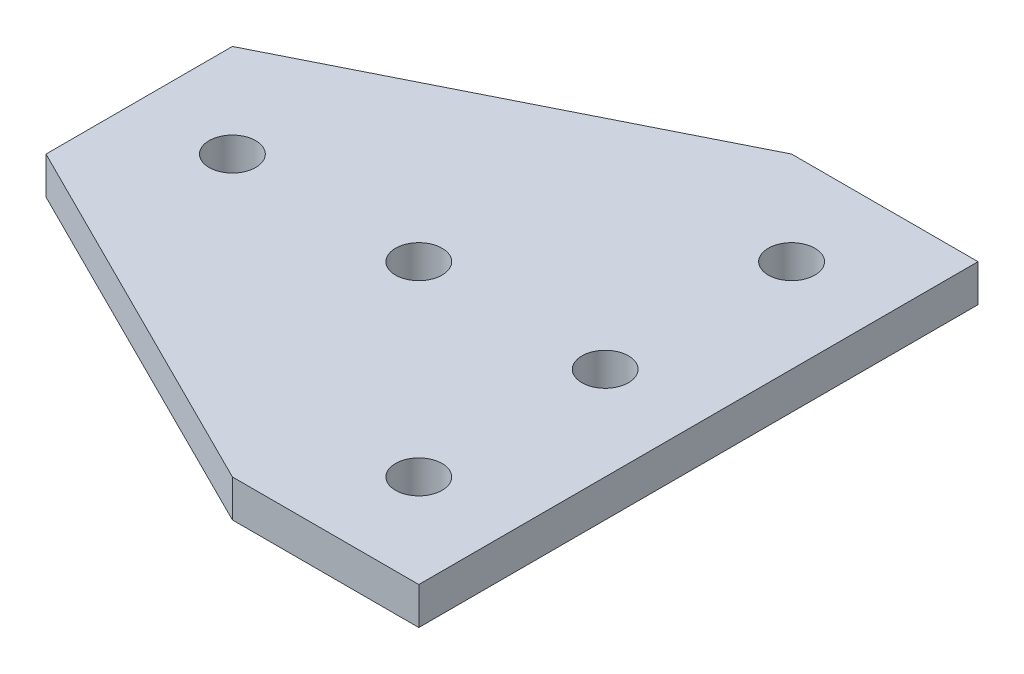
ISO-10303-21;
HEADER;
FILE_DESCRIPTION(('STEP AP214'),'2;1');
FILE_NAME('part.step','',(''),(''),'','','');
FILE_SCHEMA(('AUTOMOTIVE_DESIGN { 1 0 10303 214 1 1 1 1 }'));
ENDSEC;
DATA;
#1=APPLICATION_CONTEXT('core data for automotive mechanical design processes');
#2=APPLICATION_PROTOCOL_DEFINITION('international standard','automotive_design',2000,#1);
#3=PRODUCT_CONTEXT('',#1,'mechanical');
#4=PRODUCT('Part','Part','',(#3));
#5=PRODUCT_RELATED_PRODUCT_CATEGORY('part','',(#4));
#6=PRODUCT_DEFINITION_FORMATION('','',#4);
#7=PRODUCT_DEFINITION_CONTEXT('part definition',#1,'design');
#8=PRODUCT_DEFINITION('design','',#6,#7);
#9=PRODUCT_DEFINITION_SHAPE('','',#8);
#10=(LENGTH_UNIT() NAMED_UNIT(*) SI_UNIT(.MILLI.,.METRE.));
#11=(NAMED_UNIT(*) PLANE_ANGLE_UNIT() SI_UNIT($,.RADIAN.));
#12=(NAMED_UNIT(*) SI_UNIT($,.STERADIAN.) SOLID_ANGLE_UNIT());
#13=UNCERTAINTY_MEASURE_WITH_UNIT(LENGTH_MEASURE(1.E-05),#10,'distance_accuracy_value','');
#14=(GEOMETRIC_REPRESENTATION_CONTEXT(3) GLOBAL_UNCERTAINTY_ASSIGNED_CONTEXT((#13)) GLOBAL_UNIT_ASSIGNED_CONTEXT((#10,
#11,#12)) REPRESENTATION_CONTEXT('',''));
#15=CARTESIAN_POINT('',(0.,0.,0.));
#16=DIRECTION('',(0.,0.,1.));
#17=DIRECTION('',(1.,0.,0.));
#18=AXIS2_PLACEMENT_3D('',#15,#16,#17);
#19=CARTESIAN_POINT('',(0.,4.,0.));
#20=DIRECTION('',(0.,-1.,0.));
#21=DIRECTION('',(0.,0.,-1.));
#22=AXIS2_PLACEMENT_3D('',#19,#20,#21);
#23=PLANE('',#22);
#24=DIRECTION('',(-1.,0.,0.));
#25=VECTOR('',#24,1.);
#26=CARTESIAN_POINT('',(-10.,4.,-30.));
#27=LINE('',#26,#25);
#28=CARTESIAN_POINT('',(10.,4.,-30.));
#29=VERTEX_POINT('',#28);
#30=CARTESIAN_POINT('',(-10.,4.,-30.));
#31=VERTEX_POINT('',#30);
#32=EDGE_CURVE('E150',#29,#31,#27,.T.);
#33=ORIENTED_EDGE('',*,*,#32,.T.);
#34=DIRECTION('',(-0.894427190999916,0.,0.447213595499958));
#35=VECTOR('',#34,1.);
#36=CARTESIAN_POINT('',(-50.,4.,-9.99999999999999));
#37=LINE('',#36,#35);
#38=CARTESIAN_POINT('',(-50.,4.,-9.99999999999999));
#39=VERTEX_POINT('',#38);
#40=EDGE_CURVE('E98',#31,#39,#37,.T.);
#41=ORIENTED_EDGE('',*,*,#40,.T.);
#42=DIRECTION('',(0.,0.,1.));
#43=VECTOR('',#42,1.);
#44=CARTESIAN_POINT('',(-50.,4.,10.));
#45=LINE('',#44,#43);
#46=CARTESIAN_POINT('',(-50.,4.,10.));
#47=VERTEX_POINT('',#46);
#48=EDGE_CURVE('E111',#39,#47,#45,.T.);
#49=ORIENTED_EDGE('',*,*,#48,.T.);
#50=DIRECTION('',(0.894427190999916,0.,0.447213595499958));
#51=VECTOR('',#50,1.);
#52=CARTESIAN_POINT('',(-10.,4.,30.));
#53=LINE('',#52,#51);
#54=CARTESIAN_POINT('',(-10.,4.,30.));
#55=VERTEX_POINT('',#54);
#56=EDGE_CURVE('E105',#47,#55,#53,.T.);
#57=ORIENTED_EDGE('',*,*,#56,.T.);
#58=DIRECTION('',(1.,0.,0.));
#59=VECTOR('',#58,1.);
#60=CARTESIAN_POINT('',(10.,4.,30.));
#61=LINE('',#60,#59);
#62=CARTESIAN_POINT('',(10.,4.,30.));
#63=VERTEX_POINT('',#62);
#64=EDGE_CURVE('E109',#55,#63,#61,.T.);
#65=ORIENTED_EDGE('',*,*,#64,.T.);
#66=DIRECTION('',(0.,0.,-1.));
#67=VECTOR('',#66,1.);
#68=CARTESIAN_POINT('',(10.,4.,-30.));
#69=LINE('',#68,#67);
#70=EDGE_CURVE('E61',#63,#29,#69,.T.);
#71=ORIENTED_EDGE('',*,*,#70,.T.);
#72=EDGE_LOOP('',(#33,#41,#49,#57,#65,#71));
#73=FACE_BOUND('',#72,.T.);
#74=CARTESIAN_POINT('',(0.,4.,0.));
#75=DIRECTION('',(0.,1.,0.));
#76=DIRECTION('',(0.,0.,1.));
#77=AXIS2_PLACEMENT_3D('',#74,#75,#76);
#78=CIRCLE('',#77,2.5);
#79=CARTESIAN_POINT('',(0.,4.,2.5));
#80=VERTEX_POINT('',#79);
#81=EDGE_CURVE('E138',#80,#80,#78,.T.);
#82=ORIENTED_EDGE('',*,*,#81,.F.);
#83=EDGE_LOOP('',(#82));
#84=FACE_BOUND('',#83,.T.);
#85=CARTESIAN_POINT('',(0.,4.,-20.));
#86=DIRECTION('',(0.,1.,0.));
#87=DIRECTION('',(0.,0.,1.));
#88=AXIS2_PLACEMENT_3D('',#85,#86,#87);
#89=CIRCLE('',#88,2.5);
#90=CARTESIAN_POINT('',(0.,4.,-17.5));
#91=VERTEX_POINT('',#90);
#92=EDGE_CURVE('E234',#91,#91,#89,.T.);
#93=ORIENTED_EDGE('',*,*,#92,.F.);
#94=EDGE_LOOP('',(#93));
#95=FACE_BOUND('',#94,.T.);
#96=CARTESIAN_POINT('',(0.,4.,20.));
#97=DIRECTION('',(0.,1.,0.));
#98=DIRECTION('',(0.,0.,1.));
#99=AXIS2_PLACEMENT_3D('',#96,#97,#98);
#100=CIRCLE('',#99,2.5);
#101=CARTESIAN_POINT('',(0.,4.,22.5));
#102=VERTEX_POINT('',#101);
#103=EDGE_CURVE('E226',#102,#102,#100,.T.);
#104=ORIENTED_EDGE('',*,*,#103,.F.);
#105=EDGE_LOOP('',(#104));
#106=FACE_BOUND('',#105,.T.);
#107=CARTESIAN_POINT('',(-20.,4.,0.));
#108=DIRECTION('',(0.,1.,0.));
#109=DIRECTION('',(0.,0.,1.));
#110=AXIS2_PLACEMENT_3D('',#107,#108,#109);
#111=CIRCLE('',#110,2.5);
#112=CARTESIAN_POINT('',(-20.,4.,2.5));
#113=VERTEX_POINT('',#112);
#114=EDGE_CURVE('E218',#113,#113,#111,.T.);
#115=ORIENTED_EDGE('',*,*,#114,.F.);
#116=EDGE_LOOP('',(#115));
#117=FACE_BOUND('',#116,.T.);
#118=CARTESIAN_POINT('',(-40.,4.,0.));
#119=DIRECTION('',(0.,1.,0.));
#120=DIRECTION('',(0.,0.,1.));
#121=AXIS2_PLACEMENT_3D('',#118,#119,#120);
#122=CIRCLE('',#121,2.49999999999999);
#123=CARTESIAN_POINT('',(-40.,4.,2.49999999999999));
#124=VERTEX_POINT('',#123);
#125=EDGE_CURVE('E207',#124,#124,#122,.T.);
#126=ORIENTED_EDGE('',*,*,#125,.F.);
#127=EDGE_LOOP('',(#126));
#128=FACE_BOUND('',#127,.T.);
#129=ADVANCED_FACE('F43',(#73,#84,#95,#106,#117,#128),#23,.F.);
#130=CARTESIAN_POINT('',(0.,0.,0.));
#131=DIRECTION('',(0.,-1.,0.));
#132=DIRECTION('',(0.,0.,-1.));
#133=AXIS2_PLACEMENT_3D('',#130,#131,#132);
#134=PLANE('',#133);
#135=CARTESIAN_POINT('',(-20.,0.,0.));
#136=DIRECTION('',(0.,1.,0.));
#137=DIRECTION('',(0.,0.,1.));
#138=AXIS2_PLACEMENT_3D('',#135,#136,#137);
#139=CIRCLE('',#138,2.5);
#140=CARTESIAN_POINT('',(-20.,0.,2.5));
#141=VERTEX_POINT('',#140);
#142=EDGE_CURVE('E215',#141,#141,#139,.T.);
#143=ORIENTED_EDGE('',*,*,#142,.T.);
#144=EDGE_LOOP('',(#143));
#145=FACE_BOUND('',#144,.T.);
#146=CARTESIAN_POINT('',(0.,0.,-20.));
#147=DIRECTION('',(0.,1.,0.));
#148=DIRECTION('',(0.,0.,1.));
#149=AXIS2_PLACEMENT_3D('',#146,#147,#148);
#150=CIRCLE('',#149,2.5);
#151=CARTESIAN_POINT('',(0.,0.,-17.5));
#152=VERTEX_POINT('',#151);
#153=EDGE_CURVE('E230',#152,#152,#150,.T.);
#154=ORIENTED_EDGE('',*,*,#153,.T.);
#155=EDGE_LOOP('',(#154));
#156=FACE_BOUND('',#155,.T.);
#157=DIRECTION('',(-1.,0.,0.));
#158=VECTOR('',#157,1.);
#159=CARTESIAN_POINT('',(-10.,0.,-30.));
#160=LINE('',#159,#158);
#161=CARTESIAN_POINT('',(10.,0.,-30.));
#162=VERTEX_POINT('',#161);
#163=CARTESIAN_POINT('',(-10.,0.,-30.));
#164=VERTEX_POINT('',#163);
#165=EDGE_CURVE('E133',#162,#164,#160,.T.);
#166=ORIENTED_EDGE('',*,*,#165,.F.);
#167=DIRECTION('',(0.,0.,-1.));
#168=VECTOR('',#167,1.);
#169=CARTESIAN_POINT('',(10.,0.,-30.));
#170=LINE('',#169,#168);
#171=CARTESIAN_POINT('',(10.,0.,30.));
#172=VERTEX_POINT('',#171);
#173=EDGE_CURVE('E90',#172,#162,#170,.T.);
#174=ORIENTED_EDGE('',*,*,#173,.F.);
#175=DIRECTION('',(1.,0.,0.));
#176=VECTOR('',#175,1.);
#177=CARTESIAN_POINT('',(10.,0.,30.));
#178=LINE('',#177,#176);
#179=CARTESIAN_POINT('',(-10.,0.,30.));
#180=VERTEX_POINT('',#179);
#181=EDGE_CURVE('E84',#180,#172,#178,.T.);
#182=ORIENTED_EDGE('',*,*,#181,.F.);
#183=DIRECTION('',(0.894427190999916,0.,0.447213595499958));
#184=VECTOR('',#183,1.);
#185=CARTESIAN_POINT('',(-10.,0.,30.));
#186=LINE('',#185,#184);
#187=CARTESIAN_POINT('',(-50.,0.,10.));
#188=VERTEX_POINT('',#187);
#189=EDGE_CURVE('E120',#188,#180,#186,.T.);
#190=ORIENTED_EDGE('',*,*,#189,.F.);
#191=DIRECTION('',(0.,0.,1.));
#192=VECTOR('',#191,1.);
#193=CARTESIAN_POINT('',(-50.,0.,10.));
#194=LINE('',#193,#192);
#195=CARTESIAN_POINT('',(-50.,0.,-9.99999999999999));
#196=VERTEX_POINT('',#195);
#197=EDGE_CURVE('E141',#196,#188,#194,.T.);
#198=ORIENTED_EDGE('',*,*,#197,.F.);
#199=DIRECTION('',(-0.894427190999916,0.,0.447213595499958));
#200=VECTOR('',#199,1.);
#201=CARTESIAN_POINT('',(-50.,0.,-9.99999999999999));
#202=LINE('',#201,#200);
#203=EDGE_CURVE('E137',#164,#196,#202,.T.);
#204=ORIENTED_EDGE('',*,*,#203,.F.);
#205=EDGE_LOOP('',(#166,#174,#182,#190,#198,#204));
#206=FACE_BOUND('',#205,.T.);
#207=CARTESIAN_POINT('',(0.,0.,0.));
#208=DIRECTION('',(0.,1.,0.));
#209=DIRECTION('',(0.,0.,1.));
#210=AXIS2_PLACEMENT_3D('',#207,#208,#209);
#211=CIRCLE('',#210,2.5);
#212=CARTESIAN_POINT('',(0.,0.,2.5));
#213=VERTEX_POINT('',#212);
#214=EDGE_CURVE('E238',#213,#213,#211,.T.);
#215=ORIENTED_EDGE('',*,*,#214,.T.);
#216=EDGE_LOOP('',(#215));
#217=FACE_BOUND('',#216,.T.);
#218=CARTESIAN_POINT('',(0.,0.,20.));
#219=DIRECTION('',(0.,1.,0.));
#220=DIRECTION('',(0.,0.,1.));
#221=AXIS2_PLACEMENT_3D('',#218,#219,#220);
#222=CIRCLE('',#221,2.5);
#223=CARTESIAN_POINT('',(0.,0.,22.5));
#224=VERTEX_POINT('',#223);
#225=EDGE_CURVE('E222',#224,#224,#222,.T.);
#226=ORIENTED_EDGE('',*,*,#225,.T.);
#227=EDGE_LOOP('',(#226));
#228=FACE_BOUND('',#227,.T.);
#229=CARTESIAN_POINT('',(-40.,0.,0.));
#230=DIRECTION('',(0.,1.,0.));
#231=DIRECTION('',(0.,0.,1.));
#232=AXIS2_PLACEMENT_3D('',#229,#230,#231);
#233=CIRCLE('',#232,2.49999999999999);
#234=CARTESIAN_POINT('',(-40.,0.,2.49999999999999));
#235=VERTEX_POINT('',#234);
#236=EDGE_CURVE('E210',#235,#235,#233,.T.);
#237=ORIENTED_EDGE('',*,*,#236,.T.);
#238=EDGE_LOOP('',(#237));
#239=FACE_BOUND('',#238,.T.);
#240=ADVANCED_FACE('F163',(#145,#156,#206,#217,#228,#239),#134,.T.);
#241=CARTESIAN_POINT('',(-10.,4.,-30.));
#242=DIRECTION('',(0.,0.,1.));
#243=DIRECTION('',(1.,0.,0.));
#244=AXIS2_PLACEMENT_3D('',#241,#242,#243);
#245=PLANE('',#244);
#246=ORIENTED_EDGE('',*,*,#165,.T.);
#247=DIRECTION('',(0.,-1.,0.));
#248=VECTOR('',#247,1.);
#249=CARTESIAN_POINT('',(-10.,4.,-30.));
#250=LINE('',#249,#248);
#251=EDGE_CURVE('E11',#31,#164,#250,.T.);
#252=ORIENTED_EDGE('',*,*,#251,.F.);
#253=ORIENTED_EDGE('',*,*,#32,.F.);
#254=DIRECTION('',(0.,-1.,0.));
#255=VECTOR('',#254,1.);
#256=CARTESIAN_POINT('',(10.,4.,-30.));
#257=LINE('',#256,#255);
#258=EDGE_CURVE('E129',#29,#162,#257,.T.);
#259=ORIENTED_EDGE('',*,*,#258,.T.);
#260=EDGE_LOOP('',(#246,#252,#253,#259));
#261=FACE_BOUND('',#260,.T.);
#262=ADVANCED_FACE('F45',(#261),#245,.F.);
#263=CARTESIAN_POINT('',(-50.,4.,-9.99999999999999));
#264=DIRECTION('',(0.447213595499958,0.,0.894427190999916));
#265=DIRECTION('',(0.894427190999916,0.,-0.447213595499958));
#266=AXIS2_PLACEMENT_3D('',#263,#264,#265);
#267=PLANE('',#266);
#268=ORIENTED_EDGE('',*,*,#203,.T.);
#269=DIRECTION('',(0.,-1.,0.));
#270=VECTOR('',#269,1.);
#271=CARTESIAN_POINT('',(-50.,4.,-9.99999999999999));
#272=LINE('',#271,#270);
#273=EDGE_CURVE('E53',#39,#196,#272,.T.);
#274=ORIENTED_EDGE('',*,*,#273,.F.);
#275=ORIENTED_EDGE('',*,*,#40,.F.);
#276=ORIENTED_EDGE('',*,*,#251,.T.);
#277=EDGE_LOOP('',(#268,#274,#275,#276));
#278=FACE_BOUND('',#277,.T.);
#279=ADVANCED_FACE('F317',(#278),#267,.F.);
#280=CARTESIAN_POINT('',(-50.,4.,10.));
#281=DIRECTION('',(1.,0.,0.));
#282=DIRECTION('',(0.,0.,-1.));
#283=AXIS2_PLACEMENT_3D('',#280,#281,#282);
#284=PLANE('',#283);
#285=ORIENTED_EDGE('',*,*,#197,.T.);
#286=DIRECTION('',(0.,-1.,0.));
#287=VECTOR('',#286,1.);
#288=CARTESIAN_POINT('',(-50.,4.,10.));
#289=LINE('',#288,#287);
#290=EDGE_CURVE('E122',#47,#188,#289,.T.);
#291=ORIENTED_EDGE('',*,*,#290,.F.);
#292=ORIENTED_EDGE('',*,*,#48,.F.);
#293=ORIENTED_EDGE('',*,*,#273,.T.);
#294=EDGE_LOOP('',(#285,#291,#292,#293));
#295=FACE_BOUND('',#294,.T.);
#296=ADVANCED_FACE('F160',(#295),#284,.F.);
#297=CARTESIAN_POINT('',(-10.,4.,30.));
#298=DIRECTION('',(0.447213595499958,0.,-0.894427190999916));
#299=DIRECTION('',(-0.894427190999916,0.,-0.447213595499958));
#300=AXIS2_PLACEMENT_3D('',#297,#298,#299);
#301=PLANE('',#300);
#302=ORIENTED_EDGE('',*,*,#189,.T.);
#303=DIRECTION('',(0.,-1.,0.));
#304=VECTOR('',#303,1.);
#305=CARTESIAN_POINT('',(-10.,4.,30.));
#306=LINE('',#305,#304);
#307=EDGE_CURVE('E117',#55,#180,#306,.T.);
#308=ORIENTED_EDGE('',*,*,#307,.F.);
#309=ORIENTED_EDGE('',*,*,#56,.F.);
#310=ORIENTED_EDGE('',*,*,#290,.T.);
#311=EDGE_LOOP('',(#302,#308,#309,#310));
#312=FACE_BOUND('',#311,.T.);
#313=ADVANCED_FACE('F118',(#312),#301,.F.);
#314=CARTESIAN_POINT('',(10.,4.,30.));
#315=DIRECTION('',(0.,0.,-1.));
#316=DIRECTION('',(-1.,0.,0.));
#317=AXIS2_PLACEMENT_3D('',#314,#315,#316);
#318=PLANE('',#317);
#319=ORIENTED_EDGE('',*,*,#181,.T.);
#320=DIRECTION('',(0.,-1.,0.));
#321=VECTOR('',#320,1.);
#322=CARTESIAN_POINT('',(10.,4.,30.));
#323=LINE('',#322,#321);
#324=EDGE_CURVE('E123',#63,#172,#323,.T.);
#325=ORIENTED_EDGE('',*,*,#324,.F.);
#326=ORIENTED_EDGE('',*,*,#64,.F.);
#327=ORIENTED_EDGE('',*,*,#307,.T.);
#328=EDGE_LOOP('',(#319,#325,#326,#327));
#329=FACE_BOUND('',#328,.T.);
#330=ADVANCED_FACE('F125',(#329),#318,.F.);
#331=CARTESIAN_POINT('',(10.,4.,-30.));
#332=DIRECTION('',(-1.,0.,0.));
#333=DIRECTION('',(0.,0.,1.));
#334=AXIS2_PLACEMENT_3D('',#331,#332,#333);
#335=PLANE('',#334);
#336=ORIENTED_EDGE('',*,*,#173,.T.);
#337=ORIENTED_EDGE('',*,*,#258,.F.);
#338=ORIENTED_EDGE('',*,*,#70,.F.);
#339=ORIENTED_EDGE('',*,*,#324,.T.);
#340=EDGE_LOOP('',(#336,#337,#338,#339));
#341=FACE_BOUND('',#340,.T.);
#342=ADVANCED_FACE('F168',(#341),#335,.F.);
#343=CARTESIAN_POINT('',(0.,4.,0.));
#344=DIRECTION('',(0.,-1.,0.));
#345=DIRECTION('',(0.,0.,-1.));
#346=AXIS2_PLACEMENT_3D('',#343,#344,#345);
#347=CYLINDRICAL_SURFACE('',#346,2.5);
#348=ORIENTED_EDGE('',*,*,#81,.T.);
#349=EDGE_LOOP('',(#348));
#350=FACE_BOUND('',#349,.T.);
#351=ORIENTED_EDGE('',*,*,#214,.F.);
#352=EDGE_LOOP('',(#351));
#353=FACE_BOUND('',#352,.T.);
#354=ADVANCED_FACE('F170',(#350,#353),#347,.F.);
#355=CARTESIAN_POINT('',(0.,4.,-20.));
#356=DIRECTION('',(0.,-1.,0.));
#357=DIRECTION('',(0.,0.,-1.));
#358=AXIS2_PLACEMENT_3D('',#355,#356,#357);
#359=CYLINDRICAL_SURFACE('',#358,2.5);
#360=ORIENTED_EDGE('',*,*,#92,.T.);
#361=EDGE_LOOP('',(#360));
#362=FACE_BOUND('',#361,.T.);
#363=ORIENTED_EDGE('',*,*,#153,.F.);
#364=EDGE_LOOP('',(#363));
#365=FACE_BOUND('',#364,.T.);
#366=ADVANCED_FACE('F176',(#362,#365),#359,.F.);
#367=CARTESIAN_POINT('',(0.,4.,20.));
#368=DIRECTION('',(0.,-1.,0.));
#369=DIRECTION('',(0.,0.,-1.));
#370=AXIS2_PLACEMENT_3D('',#367,#368,#369);
#371=CYLINDRICAL_SURFACE('',#370,2.5);
#372=ORIENTED_EDGE('',*,*,#103,.T.);
#373=EDGE_LOOP('',(#372));
#374=FACE_BOUND('',#373,.T.);
#375=ORIENTED_EDGE('',*,*,#225,.F.);
#376=EDGE_LOOP('',(#375));
#377=FACE_BOUND('',#376,.T.);
#378=ADVANCED_FACE('F190',(#374,#377),#371,.F.);
#379=CARTESIAN_POINT('',(-20.,4.,0.));
#380=DIRECTION('',(0.,-1.,0.));
#381=DIRECTION('',(0.,0.,-1.));
#382=AXIS2_PLACEMENT_3D('',#379,#380,#381);
#383=CYLINDRICAL_SURFACE('',#382,2.5);
#384=ORIENTED_EDGE('',*,*,#114,.T.);
#385=EDGE_LOOP('',(#384));
#386=FACE_BOUND('',#385,.T.);
#387=ORIENTED_EDGE('',*,*,#142,.F.);
#388=EDGE_LOOP('',(#387));
#389=FACE_BOUND('',#388,.T.);
#390=ADVANCED_FACE('F194',(#386,#389),#383,.F.);
#391=CARTESIAN_POINT('',(-40.,4.,0.));
#392=DIRECTION('',(0.,-1.,0.));
#393=DIRECTION('',(0.,0.,-1.));
#394=AXIS2_PLACEMENT_3D('',#391,#392,#393);
#395=CYLINDRICAL_SURFACE('',#394,2.49999999999999);
#396=ORIENTED_EDGE('',*,*,#125,.T.);
#397=EDGE_LOOP('',(#396));
#398=FACE_BOUND('',#397,.T.);
#399=ORIENTED_EDGE('',*,*,#236,.F.);
#400=EDGE_LOOP('',(#399));
#401=FACE_BOUND('',#400,.T.);
#402=ADVANCED_FACE('F198',(#398,#401),#395,.F.);
#403=CLOSED_SHELL('',(#129,#240,#262,#279,#296,#313,#330,#342,#354,#366,#378,#390,#402));
#404=MANIFOLD_SOLID_BREP('B2',#403);
#405=ADVANCED_BREP_SHAPE_REPRESENTATION('',(#18,#404),#14);
#406=SHAPE_DEFINITION_REPRESENTATION(#9,#405);
ENDSEC;
END-ISO-10303-21;
